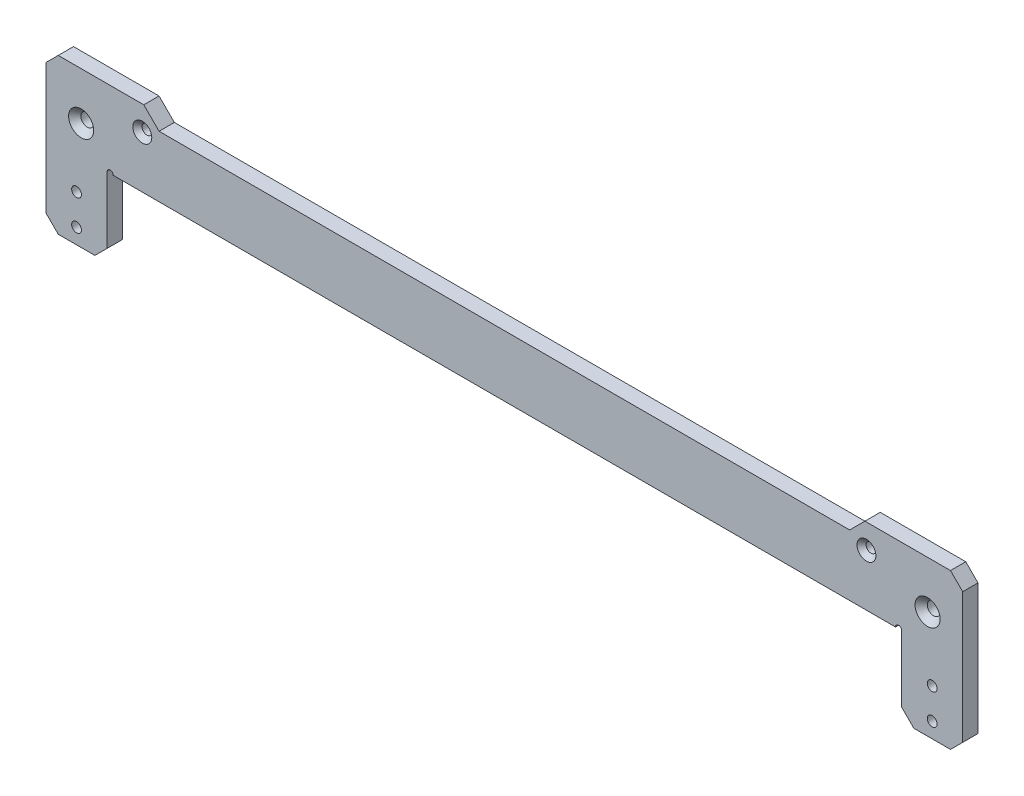
ISO-10303-21;
HEADER;
FILE_DESCRIPTION(('STEP AP214'),'2;1');
FILE_NAME('part.step','',(''),(''),'','','');
FILE_SCHEMA(('AUTOMOTIVE_DESIGN { 1 0 10303 214 1 1 1 1 }'));
ENDSEC;
DATA;
#1=APPLICATION_CONTEXT('core data for automotive mechanical design processes');
#2=APPLICATION_PROTOCOL_DEFINITION('international standard','automotive_design',2000,#1);
#3=PRODUCT_CONTEXT('',#1,'mechanical');
#4=PRODUCT('Part','Part','',(#3));
#5=PRODUCT_RELATED_PRODUCT_CATEGORY('part','',(#4));
#6=PRODUCT_DEFINITION_FORMATION('','',#4);
#7=PRODUCT_DEFINITION_CONTEXT('part definition',#1,'design');
#8=PRODUCT_DEFINITION('design','',#6,#7);
#9=PRODUCT_DEFINITION_SHAPE('','',#8);
#10=(LENGTH_UNIT() NAMED_UNIT(*) SI_UNIT(.MILLI.,.METRE.));
#11=(NAMED_UNIT(*) PLANE_ANGLE_UNIT() SI_UNIT($,.RADIAN.));
#12=(NAMED_UNIT(*) SI_UNIT($,.STERADIAN.) SOLID_ANGLE_UNIT());
#13=UNCERTAINTY_MEASURE_WITH_UNIT(LENGTH_MEASURE(1.E-05),#10,'distance_accuracy_value','');
#14=(GEOMETRIC_REPRESENTATION_CONTEXT(3) GLOBAL_UNCERTAINTY_ASSIGNED_CONTEXT((#13)) GLOBAL_UNIT_ASSIGNED_CONTEXT((#10,
#11,#12)) REPRESENTATION_CONTEXT('',''));
#15=CARTESIAN_POINT('',(0.,0.,0.));
#16=DIRECTION('',(0.,0.,1.));
#17=DIRECTION('',(1.,0.,0.));
#18=AXIS2_PLACEMENT_3D('',#15,#16,#17);
#19=CARTESIAN_POINT('',(150.,40.7,2.5));
#20=DIRECTION('',(0.,-1.,0.));
#21=DIRECTION('',(1.,0.,0.));
#22=AXIS2_PLACEMENT_3D('',#19,#20,#21);
#23=PLANE('',#22);
#24=DIRECTION('',(-1.,0.,0.));
#25=VECTOR('',#24,1.);
#26=CARTESIAN_POINT('',(150.,40.7,2.5));
#27=LINE('',#26,#25);
#28=CARTESIAN_POINT('',(146.,40.7,2.5));
#29=VERTEX_POINT('',#28);
#30=CARTESIAN_POINT('',(118.,40.7,2.5));
#31=VERTEX_POINT('',#30);
#32=EDGE_CURVE('E399',#29,#31,#27,.T.);
#33=ORIENTED_EDGE('',*,*,#32,.F.);
#34=DIRECTION('',(0.,0.,-1.));
#35=VECTOR('',#34,1.);
#36=CARTESIAN_POINT('',(146.,40.7,2.5));
#37=LINE('',#36,#35);
#38=CARTESIAN_POINT('',(146.,40.7,-2.5));
#39=VERTEX_POINT('',#38);
#40=EDGE_CURVE('E278',#29,#39,#37,.T.);
#41=ORIENTED_EDGE('',*,*,#40,.T.);
#42=DIRECTION('',(-1.,0.,0.));
#43=VECTOR('',#42,1.);
#44=CARTESIAN_POINT('',(150.,40.7,-2.5));
#45=LINE('',#44,#43);
#46=CARTESIAN_POINT('',(118.,40.7,-2.5));
#47=VERTEX_POINT('',#46);
#48=EDGE_CURVE('E218',#39,#47,#45,.T.);
#49=ORIENTED_EDGE('',*,*,#48,.T.);
#50=DIRECTION('',(0.,0.,1.));
#51=VECTOR('',#50,1.);
#52=CARTESIAN_POINT('',(118.,40.7,-2.5));
#53=LINE('',#52,#51);
#54=EDGE_CURVE('E351',#47,#31,#53,.T.);
#55=ORIENTED_EDGE('',*,*,#54,.T.);
#56=EDGE_LOOP('',(#33,#41,#49,#55));
#57=FACE_BOUND('',#56,.T.);
#58=ADVANCED_FACE('F37',(#57),#23,.F.);
#59=CARTESIAN_POINT('',(0.,0.,2.5));
#60=DIRECTION('',(0.,0.,1.));
#61=DIRECTION('',(1.,0.,0.));
#62=AXIS2_PLACEMENT_3D('',#59,#60,#61);
#63=PLANE('',#62);
#64=CARTESIAN_POINT('',(138.5,25.2,2.5));
#65=DIRECTION('',(0.,0.,1.));
#66=DIRECTION('',(1.,0.,0.));
#67=AXIS2_PLACEMENT_3D('',#64,#65,#66);
#68=CIRCLE('',#67,4.10000000000002);
#69=CARTESIAN_POINT('',(142.6,25.2,2.5));
#70=VERTEX_POINT('',#69);
#71=EDGE_CURVE('E46',#70,#70,#68,.F.);
#72=ORIENTED_EDGE('',*,*,#71,.T.);
#73=EDGE_LOOP('',(#72));
#74=FACE_BOUND('',#73,.T.);
#75=CARTESIAN_POINT('',(-138.5,25.2,2.5));
#76=DIRECTION('',(0.,0.,1.));
#77=DIRECTION('',(1.,0.,0.));
#78=AXIS2_PLACEMENT_3D('',#75,#76,#77);
#79=CIRCLE('',#78,4.10000000000002);
#80=CARTESIAN_POINT('',(-134.4,25.2,2.5));
#81=VERTEX_POINT('',#80);
#82=EDGE_CURVE('E297',#81,#81,#79,.F.);
#83=ORIENTED_EDGE('',*,*,#82,.T.);
#84=EDGE_LOOP('',(#83));
#85=FACE_BOUND('',#84,.T.);
#86=CARTESIAN_POINT('',(118.485281374238,32.7,2.5));
#87=DIRECTION('',(0.,0.,1.));
#88=DIRECTION('',(1.,0.,0.));
#89=AXIS2_PLACEMENT_3D('',#86,#87,#88);
#90=CIRCLE('',#89,3.09999999999996);
#91=CARTESIAN_POINT('',(121.585281374238,32.7,2.5));
#92=VERTEX_POINT('',#91);
#93=EDGE_CURVE('E288',#92,#92,#90,.F.);
#94=ORIENTED_EDGE('',*,*,#93,.T.);
#95=EDGE_LOOP('',(#94));
#96=FACE_BOUND('',#95,.T.);
#97=CARTESIAN_POINT('',(-118.485281374238,32.7,2.5));
#98=DIRECTION('',(0.,0.,1.));
#99=DIRECTION('',(1.,0.,0.));
#100=AXIS2_PLACEMENT_3D('',#97,#98,#99);
#101=CIRCLE('',#100,3.09999999999996);
#102=CARTESIAN_POINT('',(-115.385281374238,32.7,2.5));
#103=VERTEX_POINT('',#102);
#104=EDGE_CURVE('E285',#103,#103,#101,.F.);
#105=ORIENTED_EDGE('',*,*,#104,.T.);
#106=EDGE_LOOP('',(#105));
#107=FACE_BOUND('',#106,.T.);
#108=CARTESIAN_POINT('',(-129.,15.7,2.5));
#109=DIRECTION('',(0.,0.,-1.));
#110=DIRECTION('',(-1.,0.,0.));
#111=AXIS2_PLACEMENT_3D('',#108,#109,#110);
#112=CIRCLE('',#111,0.999999999999998);
#113=CARTESIAN_POINT('',(-130.,15.7,2.5));
#114=VERTEX_POINT('',#113);
#115=CARTESIAN_POINT('',(-128.,15.7,2.5));
#116=VERTEX_POINT('',#115);
#117=EDGE_CURVE('E188',#114,#116,#112,.T.);
#118=ORIENTED_EDGE('',*,*,#117,.T.);
#119=DIRECTION('',(1.,0.,0.));
#120=VECTOR('',#119,1.);
#121=CARTESIAN_POINT('',(-130.,15.7,2.5));
#122=LINE('',#121,#120);
#123=CARTESIAN_POINT('',(128.,15.7,2.5));
#124=VERTEX_POINT('',#123);
#125=EDGE_CURVE('E388',#116,#124,#122,.T.);
#126=ORIENTED_EDGE('',*,*,#125,.T.);
#127=CARTESIAN_POINT('',(129.,15.7,2.5));
#128=DIRECTION('',(0.,0.,-1.));
#129=DIRECTION('',(-1.,0.,0.));
#130=AXIS2_PLACEMENT_3D('',#127,#128,#129);
#131=CIRCLE('',#130,0.999999999999998);
#132=CARTESIAN_POINT('',(130.,15.7,2.5));
#133=VERTEX_POINT('',#132);
#134=EDGE_CURVE('E182',#124,#133,#131,.T.);
#135=ORIENTED_EDGE('',*,*,#134,.T.);
#136=DIRECTION('',(0.,-1.,0.));
#137=VECTOR('',#136,1.);
#138=CARTESIAN_POINT('',(130.,15.7,2.5));
#139=LINE('',#138,#137);
#140=CARTESIAN_POINT('',(130.,-5.99999999999996,2.5));
#141=VERTEX_POINT('',#140);
#142=EDGE_CURVE('E390',#133,#141,#139,.T.);
#143=ORIENTED_EDGE('',*,*,#142,.T.);
#144=DIRECTION('',(-0.707106781186543,0.707106781186552,0.));
#145=VECTOR('',#144,1.);
#146=CARTESIAN_POINT('',(62.0000000000009,62.,2.5));
#147=LINE('',#146,#145);
#148=CARTESIAN_POINT('',(134.,-10.,2.5));
#149=VERTEX_POINT('',#148);
#150=EDGE_CURVE('E251',#141,#149,#147,.F.);
#151=ORIENTED_EDGE('',*,*,#150,.T.);
#152=DIRECTION('',(1.,0.,0.));
#153=VECTOR('',#152,1.);
#154=CARTESIAN_POINT('',(130.,-10.,2.5));
#155=LINE('',#154,#153);
#156=CARTESIAN_POINT('',(146.,-10.,2.5));
#157=VERTEX_POINT('',#156);
#158=EDGE_CURVE('E393',#149,#157,#155,.T.);
#159=ORIENTED_EDGE('',*,*,#158,.T.);
#160=DIRECTION('',(-0.70710678118655,-0.707106781186545,0.));
#161=VECTOR('',#160,1.);
#162=CARTESIAN_POINT('',(77.9999999999994,-77.9999999999999,2.5));
#163=LINE('',#162,#161);
#164=CARTESIAN_POINT('',(150.,-6.00000000000002,2.5));
#165=VERTEX_POINT('',#164);
#166=EDGE_CURVE('E249',#157,#165,#163,.F.);
#167=ORIENTED_EDGE('',*,*,#166,.T.);
#168=DIRECTION('',(0.,1.,0.));
#169=VECTOR('',#168,1.);
#170=CARTESIAN_POINT('',(150.,-10.,2.5));
#171=LINE('',#170,#169);
#172=CARTESIAN_POINT('',(150.,36.6999999999999,2.5));
#173=VERTEX_POINT('',#172);
#174=EDGE_CURVE('E396',#165,#173,#171,.T.);
#175=ORIENTED_EDGE('',*,*,#174,.T.);
#176=DIRECTION('',(0.707106781186545,-0.70710678118655,0.));
#177=VECTOR('',#176,1.);
#178=CARTESIAN_POINT('',(93.3500000000004,93.3499999999998,2.5));
#179=LINE('',#178,#177);
#180=EDGE_CURVE('E53',#173,#29,#179,.F.);
#181=ORIENTED_EDGE('',*,*,#180,.T.);
#182=ORIENTED_EDGE('',*,*,#32,.T.);
#183=DIRECTION('',(0.707106781186547,0.707106781186548,0.));
#184=VECTOR('',#183,1.);
#185=CARTESIAN_POINT('',(118.,40.7,2.5));
#186=LINE('',#185,#184);
#187=CARTESIAN_POINT('',(113.,35.6999999999999,2.5));
#188=VERTEX_POINT('',#187);
#189=EDGE_CURVE('E337',#188,#31,#186,.T.);
#190=ORIENTED_EDGE('',*,*,#189,.F.);
#191=DIRECTION('',(1.,0.,0.));
#192=VECTOR('',#191,1.);
#193=CARTESIAN_POINT('',(113.,35.6999999999999,2.5));
#194=LINE('',#193,#192);
#195=CARTESIAN_POINT('',(-113.,35.6999999999999,2.5));
#196=VERTEX_POINT('',#195);
#197=EDGE_CURVE('E346',#196,#188,#194,.T.);
#198=ORIENTED_EDGE('',*,*,#197,.F.);
#199=DIRECTION('',(0.707106781186546,-0.707106781186549,0.));
#200=VECTOR('',#199,1.);
#201=CARTESIAN_POINT('',(-113.,35.6999999999999,2.5));
#202=LINE('',#201,#200);
#203=CARTESIAN_POINT('',(-118.,40.7,2.5));
#204=VERTEX_POINT('',#203);
#205=EDGE_CURVE('E187',#204,#196,#202,.T.);
#206=ORIENTED_EDGE('',*,*,#205,.F.);
#207=CARTESIAN_POINT('',(-146.,40.6999999999999,2.5));
#208=VERTEX_POINT('',#207);
#209=EDGE_CURVE('E398',#204,#208,#27,.T.);
#210=ORIENTED_EDGE('',*,*,#209,.T.);
#211=DIRECTION('',(0.70710678118655,0.707106781186545,0.));
#212=VECTOR('',#211,1.);
#213=CARTESIAN_POINT('',(-93.3499999999995,93.3500000000002,2.5));
#214=LINE('',#213,#212);
#215=CARTESIAN_POINT('',(-150.,36.7,2.5));
#216=VERTEX_POINT('',#215);
#217=EDGE_CURVE('E257',#208,#216,#214,.F.);
#218=ORIENTED_EDGE('',*,*,#217,.T.);
#219=DIRECTION('',(0.,-1.,0.));
#220=VECTOR('',#219,1.);
#221=CARTESIAN_POINT('',(-150.,40.6999999999999,2.5));
#222=LINE('',#221,#220);
#223=CARTESIAN_POINT('',(-150.,-5.99999999999994,2.5));
#224=VERTEX_POINT('',#223);
#225=EDGE_CURVE('E227',#216,#224,#222,.T.);
#226=ORIENTED_EDGE('',*,*,#225,.T.);
#227=DIRECTION('',(-0.707106781186545,0.70710678118655,0.));
#228=VECTOR('',#227,1.);
#229=CARTESIAN_POINT('',(-78.0000000000006,-78.,2.5));
#230=LINE('',#229,#228);
#231=CARTESIAN_POINT('',(-146.,-10.,2.5));
#232=VERTEX_POINT('',#231);
#233=EDGE_CURVE('E255',#224,#232,#230,.F.);
#234=ORIENTED_EDGE('',*,*,#233,.T.);
#235=DIRECTION('',(1.,0.,0.));
#236=VECTOR('',#235,1.);
#237=CARTESIAN_POINT('',(-150.,-10.,2.5));
#238=LINE('',#237,#236);
#239=CARTESIAN_POINT('',(-134.,-10.,2.5));
#240=VERTEX_POINT('',#239);
#241=EDGE_CURVE('E223',#232,#240,#238,.T.);
#242=ORIENTED_EDGE('',*,*,#241,.T.);
#243=DIRECTION('',(-0.70710678118655,-0.707106781186545,0.));
#244=VECTOR('',#243,1.);
#245=CARTESIAN_POINT('',(-61.9999999999996,62.0000000000001,2.5));
#246=LINE('',#245,#244);
#247=CARTESIAN_POINT('',(-130.,-6.00000000000002,2.5));
#248=VERTEX_POINT('',#247);
#249=EDGE_CURVE('E253',#240,#248,#246,.F.);
#250=ORIENTED_EDGE('',*,*,#249,.T.);
#251=DIRECTION('',(0.,1.,0.));
#252=VECTOR('',#251,1.);
#253=CARTESIAN_POINT('',(-130.,-10.,2.5));
#254=LINE('',#253,#252);
#255=EDGE_CURVE('E385',#248,#114,#254,.T.);
#256=ORIENTED_EDGE('',*,*,#255,.T.);
#257=EDGE_LOOP('',(#118,#126,#135,#143,#151,#159,#167,#175,#181,#182,#190,#198,#206,#210,#218,
#226,#234,#242,#250,#256));
#258=FACE_BOUND('',#257,.T.);
#259=CARTESIAN_POINT('',(140.,5.00000000000001,2.5));
#260=DIRECTION('',(0.,0.,1.));
#261=DIRECTION('',(1.,0.,0.));
#262=AXIS2_PLACEMENT_3D('',#259,#260,#261);
#263=CIRCLE('',#262,1.59999999999999);
#264=CARTESIAN_POINT('',(141.6,5.00000000000001,2.5));
#265=VERTEX_POINT('',#264);
#266=EDGE_CURVE('E366',#265,#265,#263,.T.);
#267=ORIENTED_EDGE('',*,*,#266,.F.);
#268=EDGE_LOOP('',(#267));
#269=FACE_BOUND('',#268,.T.);
#270=CARTESIAN_POINT('',(-140.,4.99999999999998,2.5));
#271=DIRECTION('',(0.,0.,1.));
#272=DIRECTION('',(1.,0.,0.));
#273=AXIS2_PLACEMENT_3D('',#270,#271,#272);
#274=CIRCLE('',#273,1.59999999999999);
#275=CARTESIAN_POINT('',(-138.4,4.99999999999998,2.5));
#276=VERTEX_POINT('',#275);
#277=EDGE_CURVE('E378',#276,#276,#274,.T.);
#278=ORIENTED_EDGE('',*,*,#277,.F.);
#279=EDGE_LOOP('',(#278));
#280=FACE_BOUND('',#279,.T.);
#281=CARTESIAN_POINT('',(-140.,-5.00000000000002,2.5));
#282=DIRECTION('',(0.,0.,1.));
#283=DIRECTION('',(1.,0.,0.));
#284=AXIS2_PLACEMENT_3D('',#281,#282,#283);
#285=CIRCLE('',#284,1.59999999999999);
#286=CARTESIAN_POINT('',(-138.4,-5.00000000000002,2.5));
#287=VERTEX_POINT('',#286);
#288=EDGE_CURVE('E372',#287,#287,#285,.T.);
#289=ORIENTED_EDGE('',*,*,#288,.F.);
#290=EDGE_LOOP('',(#289));
#291=FACE_BOUND('',#290,.T.);
#292=CARTESIAN_POINT('',(140.,-4.99999999999999,2.5));
#293=DIRECTION('',(0.,0.,1.));
#294=DIRECTION('',(1.,0.,0.));
#295=AXIS2_PLACEMENT_3D('',#292,#293,#294);
#296=CIRCLE('',#295,1.59999999999999);
#297=CARTESIAN_POINT('',(141.6,-4.99999999999999,2.5));
#298=VERTEX_POINT('',#297);
#299=EDGE_CURVE('E360',#298,#298,#296,.T.);
#300=ORIENTED_EDGE('',*,*,#299,.F.);
#301=EDGE_LOOP('',(#300));
#302=FACE_BOUND('',#301,.T.);
#303=ADVANCED_FACE('F302',(#74,#85,#96,#107,#258,#269,#280,#291,#302),#63,.T.);
#304=CARTESIAN_POINT('',(0.,0.,-2.5));
#305=DIRECTION('',(0.,0.,1.));
#306=DIRECTION('',(1.,0.,0.));
#307=AXIS2_PLACEMENT_3D('',#304,#305,#306);
#308=PLANE('',#307);
#309=CARTESIAN_POINT('',(-138.5,25.2,-2.5));
#310=DIRECTION('',(0.,0.,1.));
#311=DIRECTION('',(1.,0.,0.));
#312=AXIS2_PLACEMENT_3D('',#309,#310,#311);
#313=CIRCLE('',#312,2.09999999999999);
#314=CARTESIAN_POINT('',(-136.4,25.2,-2.5));
#315=VERTEX_POINT('',#314);
#316=EDGE_CURVE('E199',#315,#315,#313,.T.);
#317=ORIENTED_EDGE('',*,*,#316,.T.);
#318=EDGE_LOOP('',(#317));
#319=FACE_BOUND('',#318,.T.);
#320=CARTESIAN_POINT('',(118.485281374238,32.7,-2.5));
#321=DIRECTION('',(0.,0.,1.));
#322=DIRECTION('',(1.,0.,0.));
#323=AXIS2_PLACEMENT_3D('',#320,#321,#322);
#324=CIRCLE('',#323,1.60000000000001);
#325=CARTESIAN_POINT('',(120.085281374238,32.7,-2.5));
#326=VERTEX_POINT('',#325);
#327=EDGE_CURVE('E324',#326,#326,#324,.T.);
#328=ORIENTED_EDGE('',*,*,#327,.T.);
#329=EDGE_LOOP('',(#328));
#330=FACE_BOUND('',#329,.T.);
#331=CARTESIAN_POINT('',(-118.485281374238,32.7,-2.5));
#332=DIRECTION('',(0.,0.,1.));
#333=DIRECTION('',(1.,0.,0.));
#334=AXIS2_PLACEMENT_3D('',#331,#332,#333);
#335=CIRCLE('',#334,1.60000000000001);
#336=CARTESIAN_POINT('',(-116.885281374238,32.7,-2.5));
#337=VERTEX_POINT('',#336);
#338=EDGE_CURVE('E321',#337,#337,#335,.T.);
#339=ORIENTED_EDGE('',*,*,#338,.T.);
#340=EDGE_LOOP('',(#339));
#341=FACE_BOUND('',#340,.T.);
#342=CARTESIAN_POINT('',(138.5,25.2,-2.5));
#343=DIRECTION('',(0.,0.,1.));
#344=DIRECTION('',(-1.,0.,0.));
#345=AXIS2_PLACEMENT_3D('',#342,#343,#344);
#346=CIRCLE('',#345,2.09999999999999);
#347=CARTESIAN_POINT('',(136.4,25.2,-2.5));
#348=VERTEX_POINT('',#347);
#349=EDGE_CURVE('E319',#348,#348,#346,.T.);
#350=ORIENTED_EDGE('',*,*,#349,.T.);
#351=EDGE_LOOP('',(#350));
#352=FACE_BOUND('',#351,.T.);
#353=DIRECTION('',(1.,0.,0.));
#354=VECTOR('',#353,1.);
#355=CARTESIAN_POINT('',(-130.,15.7,-2.5));
#356=LINE('',#355,#354);
#357=CARTESIAN_POINT('',(-128.,15.7,-2.5));
#358=VERTEX_POINT('',#357);
#359=CARTESIAN_POINT('',(128.,15.7,-2.5));
#360=VERTEX_POINT('',#359);
#361=EDGE_CURVE('E196',#358,#360,#356,.T.);
#362=ORIENTED_EDGE('',*,*,#361,.F.);
#363=CARTESIAN_POINT('',(-129.,15.7,-2.5));
#364=DIRECTION('',(0.,0.,-1.));
#365=DIRECTION('',(-1.,0.,0.));
#366=AXIS2_PLACEMENT_3D('',#363,#364,#365);
#367=CIRCLE('',#366,0.999999999999998);
#368=CARTESIAN_POINT('',(-130.,15.7,-2.5));
#369=VERTEX_POINT('',#368);
#370=EDGE_CURVE('E330',#369,#358,#367,.T.);
#371=ORIENTED_EDGE('',*,*,#370,.F.);
#372=DIRECTION('',(0.,1.,0.));
#373=VECTOR('',#372,1.);
#374=CARTESIAN_POINT('',(-130.,-10.,-2.5));
#375=LINE('',#374,#373);
#376=CARTESIAN_POINT('',(-130.,-6.00000000000002,-2.5));
#377=VERTEX_POINT('',#376);
#378=EDGE_CURVE('E204',#377,#369,#375,.T.);
#379=ORIENTED_EDGE('',*,*,#378,.F.);
#380=DIRECTION('',(0.70710678118655,0.707106781186545,0.));
#381=VECTOR('',#380,1.);
#382=CARTESIAN_POINT('',(-130.,-6.00000000000002,-2.5));
#383=LINE('',#382,#381);
#384=CARTESIAN_POINT('',(-134.,-10.,-2.5));
#385=VERTEX_POINT('',#384);
#386=EDGE_CURVE('E240',#377,#385,#383,.F.);
#387=ORIENTED_EDGE('',*,*,#386,.T.);
#388=DIRECTION('',(1.,0.,0.));
#389=VECTOR('',#388,1.);
#390=CARTESIAN_POINT('',(-150.,-10.,-2.5));
#391=LINE('',#390,#389);
#392=CARTESIAN_POINT('',(-146.,-10.,-2.5));
#393=VERTEX_POINT('',#392);
#394=EDGE_CURVE('E209',#393,#385,#391,.T.);
#395=ORIENTED_EDGE('',*,*,#394,.F.);
#396=DIRECTION('',(0.707106781186545,-0.70710678118655,0.));
#397=VECTOR('',#396,1.);
#398=CARTESIAN_POINT('',(-146.,-10.,-2.5));
#399=LINE('',#398,#397);
#400=CARTESIAN_POINT('',(-150.,-5.99999999999994,-2.5));
#401=VERTEX_POINT('',#400);
#402=EDGE_CURVE('E242',#393,#401,#399,.F.);
#403=ORIENTED_EDGE('',*,*,#402,.T.);
#404=DIRECTION('',(0.,-1.,0.));
#405=VECTOR('',#404,1.);
#406=CARTESIAN_POINT('',(-150.,40.6999999999999,-2.5));
#407=LINE('',#406,#405);
#408=CARTESIAN_POINT('',(-150.,36.7,-2.5));
#409=VERTEX_POINT('',#408);
#410=EDGE_CURVE('E220',#409,#401,#407,.T.);
#411=ORIENTED_EDGE('',*,*,#410,.F.);
#412=DIRECTION('',(-0.70710678118655,-0.707106781186545,0.));
#413=VECTOR('',#412,1.);
#414=CARTESIAN_POINT('',(-150.,36.7,-2.5));
#415=LINE('',#414,#413);
#416=CARTESIAN_POINT('',(-146.,40.6999999999999,-2.5));
#417=VERTEX_POINT('',#416);
#418=EDGE_CURVE('E244',#409,#417,#415,.F.);
#419=ORIENTED_EDGE('',*,*,#418,.T.);
#420=CARTESIAN_POINT('',(-118.,40.6999999999999,-2.5));
#421=VERTEX_POINT('',#420);
#422=EDGE_CURVE('E217',#421,#417,#45,.T.);
#423=ORIENTED_EDGE('',*,*,#422,.F.);
#424=DIRECTION('',(0.707106781186546,-0.707106781186549,0.));
#425=VECTOR('',#424,1.);
#426=CARTESIAN_POINT('',(-113.,35.6999999999999,-2.5));
#427=LINE('',#426,#425);
#428=CARTESIAN_POINT('',(-113.,35.6999999999999,-2.5));
#429=VERTEX_POINT('',#428);
#430=EDGE_CURVE('E333',#421,#429,#427,.T.);
#431=ORIENTED_EDGE('',*,*,#430,.T.);
#432=DIRECTION('',(1.,0.,0.));
#433=VECTOR('',#432,1.);
#434=CARTESIAN_POINT('',(113.,35.6999999999999,-2.5));
#435=LINE('',#434,#433);
#436=CARTESIAN_POINT('',(113.,35.6999999999999,-2.5));
#437=VERTEX_POINT('',#436);
#438=EDGE_CURVE('E336',#429,#437,#435,.T.);
#439=ORIENTED_EDGE('',*,*,#438,.T.);
#440=DIRECTION('',(0.707106781186547,0.707106781186548,0.));
#441=VECTOR('',#440,1.);
#442=CARTESIAN_POINT('',(118.,40.7,-2.5));
#443=LINE('',#442,#441);
#444=EDGE_CURVE('E340',#437,#47,#443,.T.);
#445=ORIENTED_EDGE('',*,*,#444,.T.);
#446=ORIENTED_EDGE('',*,*,#48,.F.);
#447=DIRECTION('',(-0.707106781186545,0.70710678118655,0.));
#448=VECTOR('',#447,1.);
#449=CARTESIAN_POINT('',(146.,40.7,-2.5));
#450=LINE('',#449,#448);
#451=CARTESIAN_POINT('',(150.,36.6999999999999,-2.5));
#452=VERTEX_POINT('',#451);
#453=EDGE_CURVE('E234',#39,#452,#450,.F.);
#454=ORIENTED_EDGE('',*,*,#453,.T.);
#455=DIRECTION('',(0.,1.,0.));
#456=VECTOR('',#455,1.);
#457=CARTESIAN_POINT('',(150.,-10.,-2.5));
#458=LINE('',#457,#456);
#459=CARTESIAN_POINT('',(150.,-6.00000000000002,-2.5));
#460=VERTEX_POINT('',#459);
#461=EDGE_CURVE('E215',#460,#452,#458,.T.);
#462=ORIENTED_EDGE('',*,*,#461,.F.);
#463=DIRECTION('',(0.70710678118655,0.707106781186545,0.));
#464=VECTOR('',#463,1.);
#465=CARTESIAN_POINT('',(150.,-6.00000000000002,-2.5));
#466=LINE('',#465,#464);
#467=CARTESIAN_POINT('',(146.,-10.,-2.5));
#468=VERTEX_POINT('',#467);
#469=EDGE_CURVE('E236',#460,#468,#466,.F.);
#470=ORIENTED_EDGE('',*,*,#469,.T.);
#471=DIRECTION('',(1.,0.,0.));
#472=VECTOR('',#471,1.);
#473=CARTESIAN_POINT('',(130.,-10.,-2.5));
#474=LINE('',#473,#472);
#475=CARTESIAN_POINT('',(134.,-10.,-2.5));
#476=VERTEX_POINT('',#475);
#477=EDGE_CURVE('E206',#476,#468,#474,.T.);
#478=ORIENTED_EDGE('',*,*,#477,.F.);
#479=DIRECTION('',(0.707106781186543,-0.707106781186552,0.));
#480=VECTOR('',#479,1.);
#481=CARTESIAN_POINT('',(134.,-10.,-2.5));
#482=LINE('',#481,#480);
#483=CARTESIAN_POINT('',(130.,-5.99999999999996,-2.5));
#484=VERTEX_POINT('',#483);
#485=EDGE_CURVE('E238',#476,#484,#482,.F.);
#486=ORIENTED_EDGE('',*,*,#485,.T.);
#487=DIRECTION('',(0.,-1.,0.));
#488=VECTOR('',#487,1.);
#489=CARTESIAN_POINT('',(130.,15.7,-2.5));
#490=LINE('',#489,#488);
#491=CARTESIAN_POINT('',(130.,15.7,-2.5));
#492=VERTEX_POINT('',#491);
#493=EDGE_CURVE('E198',#492,#484,#490,.T.);
#494=ORIENTED_EDGE('',*,*,#493,.F.);
#495=CARTESIAN_POINT('',(129.,15.7,-2.5));
#496=DIRECTION('',(0.,0.,-1.));
#497=DIRECTION('',(-1.,0.,0.));
#498=AXIS2_PLACEMENT_3D('',#495,#496,#497);
#499=CIRCLE('',#498,0.999999999999998);
#500=EDGE_CURVE('E179',#360,#492,#499,.T.);
#501=ORIENTED_EDGE('',*,*,#500,.F.);
#502=EDGE_LOOP('',(#362,#371,#379,#387,#395,#403,#411,#419,#423,#431,#439,#445,#446,#454,#462,
#470,#478,#486,#494,#501));
#503=FACE_BOUND('',#502,.T.);
#504=CARTESIAN_POINT('',(-140.,4.99999999999998,-2.5));
#505=DIRECTION('',(0.,0.,1.));
#506=DIRECTION('',(1.,0.,0.));
#507=AXIS2_PLACEMENT_3D('',#504,#505,#506);
#508=CIRCLE('',#507,1.59999999999999);
#509=CARTESIAN_POINT('',(-138.4,4.99999999999998,-2.5));
#510=VERTEX_POINT('',#509);
#511=EDGE_CURVE('E375',#510,#510,#508,.T.);
#512=ORIENTED_EDGE('',*,*,#511,.T.);
#513=EDGE_LOOP('',(#512));
#514=FACE_BOUND('',#513,.T.);
#515=CARTESIAN_POINT('',(-140.,-5.00000000000002,-2.5));
#516=DIRECTION('',(0.,0.,1.));
#517=DIRECTION('',(1.,0.,0.));
#518=AXIS2_PLACEMENT_3D('',#515,#516,#517);
#519=CIRCLE('',#518,1.59999999999999);
#520=CARTESIAN_POINT('',(-138.4,-5.00000000000002,-2.5));
#521=VERTEX_POINT('',#520);
#522=EDGE_CURVE('E369',#521,#521,#519,.T.);
#523=ORIENTED_EDGE('',*,*,#522,.T.);
#524=EDGE_LOOP('',(#523));
#525=FACE_BOUND('',#524,.T.);
#526=CARTESIAN_POINT('',(140.,5.00000000000001,-2.5));
#527=DIRECTION('',(0.,0.,1.));
#528=DIRECTION('',(1.,0.,0.));
#529=AXIS2_PLACEMENT_3D('',#526,#527,#528);
#530=CIRCLE('',#529,1.59999999999999);
#531=CARTESIAN_POINT('',(141.6,5.00000000000001,-2.5));
#532=VERTEX_POINT('',#531);
#533=EDGE_CURVE('E363',#532,#532,#530,.T.);
#534=ORIENTED_EDGE('',*,*,#533,.T.);
#535=EDGE_LOOP('',(#534));
#536=FACE_BOUND('',#535,.T.);
#537=CARTESIAN_POINT('',(140.,-4.99999999999999,-2.5));
#538=DIRECTION('',(0.,0.,1.));
#539=DIRECTION('',(1.,0.,0.));
#540=AXIS2_PLACEMENT_3D('',#537,#538,#539);
#541=CIRCLE('',#540,1.59999999999999);
#542=CARTESIAN_POINT('',(141.6,-4.99999999999999,-2.5));
#543=VERTEX_POINT('',#542);
#544=EDGE_CURVE('E354',#543,#543,#541,.T.);
#545=ORIENTED_EDGE('',*,*,#544,.T.);
#546=EDGE_LOOP('',(#545));
#547=FACE_BOUND('',#546,.T.);
#548=ADVANCED_FACE('F193',(#319,#330,#341,#352,#503,#514,#525,#536,#547),#308,.F.);
#549=CARTESIAN_POINT('',(-150.,-10.,2.5));
#550=DIRECTION('',(0.,1.,0.));
#551=DIRECTION('',(0.,0.,1.));
#552=AXIS2_PLACEMENT_3D('',#549,#550,#551);
#553=PLANE('',#552);
#554=ORIENTED_EDGE('',*,*,#241,.F.);
#555=DIRECTION('',(0.,0.,-1.));
#556=VECTOR('',#555,1.);
#557=CARTESIAN_POINT('',(-146.,-10.,2.5));
#558=LINE('',#557,#556);
#559=EDGE_CURVE('E261',#232,#393,#558,.T.);
#560=ORIENTED_EDGE('',*,*,#559,.T.);
#561=ORIENTED_EDGE('',*,*,#394,.T.);
#562=DIRECTION('',(0.,0.,1.));
#563=VECTOR('',#562,1.);
#564=CARTESIAN_POINT('',(-134.,-10.,2.5));
#565=LINE('',#564,#563);
#566=EDGE_CURVE('E259',#385,#240,#565,.T.);
#567=ORIENTED_EDGE('',*,*,#566,.T.);
#568=EDGE_LOOP('',(#554,#560,#561,#567));
#569=FACE_BOUND('',#568,.T.);
#570=ADVANCED_FACE('F407',(#569),#553,.F.);
#571=CARTESIAN_POINT('',(-130.,-10.,2.5));
#572=DIRECTION('',(-1.,0.,0.));
#573=DIRECTION('',(0.,0.,1.));
#574=AXIS2_PLACEMENT_3D('',#571,#572,#573);
#575=PLANE('',#574);
#576=ORIENTED_EDGE('',*,*,#255,.F.);
#577=DIRECTION('',(0.,0.,-1.));
#578=VECTOR('',#577,1.);
#579=CARTESIAN_POINT('',(-130.,-6.00000000000002,2.5));
#580=LINE('',#579,#578);
#581=EDGE_CURVE('E264',#248,#377,#580,.T.);
#582=ORIENTED_EDGE('',*,*,#581,.T.);
#583=ORIENTED_EDGE('',*,*,#378,.T.);
#584=DIRECTION('',(0.,0.,-1.));
#585=VECTOR('',#584,1.);
#586=CARTESIAN_POINT('',(-130.,15.7,2.5));
#587=LINE('',#586,#585);
#588=EDGE_CURVE('E226',#114,#369,#587,.T.);
#589=ORIENTED_EDGE('',*,*,#588,.F.);
#590=EDGE_LOOP('',(#576,#582,#583,#589));
#591=FACE_BOUND('',#590,.T.);
#592=ADVANCED_FACE('F417',(#591),#575,.F.);
#593=CARTESIAN_POINT('',(-130.,15.7,2.5));
#594=DIRECTION('',(0.,1.,0.));
#595=DIRECTION('',(0.,0.,1.));
#596=AXIS2_PLACEMENT_3D('',#593,#594,#595);
#597=PLANE('',#596);
#598=ORIENTED_EDGE('',*,*,#125,.F.);
#599=DIRECTION('',(0.,0.,-1.));
#600=VECTOR('',#599,1.);
#601=CARTESIAN_POINT('',(-128.,15.7,2.5));
#602=LINE('',#601,#600);
#603=EDGE_CURVE('E203',#116,#358,#602,.T.);
#604=ORIENTED_EDGE('',*,*,#603,.T.);
#605=ORIENTED_EDGE('',*,*,#361,.T.);
#606=DIRECTION('',(0.,0.,-1.));
#607=VECTOR('',#606,1.);
#608=CARTESIAN_POINT('',(128.,15.7,2.5));
#609=LINE('',#608,#607);
#610=EDGE_CURVE('E176',#360,#124,#609,.F.);
#611=ORIENTED_EDGE('',*,*,#610,.T.);
#612=EDGE_LOOP('',(#598,#604,#605,#611));
#613=FACE_BOUND('',#612,.T.);
#614=ADVANCED_FACE('F202',(#613),#597,.F.);
#615=CARTESIAN_POINT('',(130.,15.7,2.5));
#616=DIRECTION('',(1.,0.,0.));
#617=DIRECTION('',(0.,0.,-1.));
#618=AXIS2_PLACEMENT_3D('',#615,#616,#617);
#619=PLANE('',#618);
#620=ORIENTED_EDGE('',*,*,#493,.T.);
#621=DIRECTION('',(0.,0.,1.));
#622=VECTOR('',#621,1.);
#623=CARTESIAN_POINT('',(130.,-5.99999999999996,2.5));
#624=LINE('',#623,#622);
#625=EDGE_CURVE('E272',#484,#141,#624,.T.);
#626=ORIENTED_EDGE('',*,*,#625,.T.);
#627=ORIENTED_EDGE('',*,*,#142,.F.);
#628=DIRECTION('',(0.,0.,-1.));
#629=VECTOR('',#628,1.);
#630=CARTESIAN_POINT('',(130.,15.7,2.5));
#631=LINE('',#630,#629);
#632=EDGE_CURVE('E224',#133,#492,#631,.T.);
#633=ORIENTED_EDGE('',*,*,#632,.T.);
#634=EDGE_LOOP('',(#620,#626,#627,#633));
#635=FACE_BOUND('',#634,.T.);
#636=ADVANCED_FACE('F423',(#635),#619,.F.);
#637=CARTESIAN_POINT('',(130.,-10.,2.5));
#638=DIRECTION('',(0.,1.,0.));
#639=DIRECTION('',(0.,0.,1.));
#640=AXIS2_PLACEMENT_3D('',#637,#638,#639);
#641=PLANE('',#640);
#642=ORIENTED_EDGE('',*,*,#158,.F.);
#643=DIRECTION('',(0.,0.,-1.));
#644=VECTOR('',#643,1.);
#645=CARTESIAN_POINT('',(134.,-10.,2.5));
#646=LINE('',#645,#644);
#647=EDGE_CURVE('E269',#149,#476,#646,.T.);
#648=ORIENTED_EDGE('',*,*,#647,.T.);
#649=ORIENTED_EDGE('',*,*,#477,.T.);
#650=DIRECTION('',(0.,0.,1.));
#651=VECTOR('',#650,1.);
#652=CARTESIAN_POINT('',(146.,-10.,2.5));
#653=LINE('',#652,#651);
#654=EDGE_CURVE('E267',#468,#157,#653,.T.);
#655=ORIENTED_EDGE('',*,*,#654,.T.);
#656=EDGE_LOOP('',(#642,#648,#649,#655));
#657=FACE_BOUND('',#656,.T.);
#658=ADVANCED_FACE('F431',(#657),#641,.F.);
#659=CARTESIAN_POINT('',(150.,-10.,2.5));
#660=DIRECTION('',(-1.,0.,0.));
#661=DIRECTION('',(0.,0.,1.));
#662=AXIS2_PLACEMENT_3D('',#659,#660,#661);
#663=PLANE('',#662);
#664=ORIENTED_EDGE('',*,*,#174,.F.);
#665=DIRECTION('',(0.,0.,-1.));
#666=VECTOR('',#665,1.);
#667=CARTESIAN_POINT('',(150.,-6.00000000000002,2.5));
#668=LINE('',#667,#666);
#669=EDGE_CURVE('E275',#165,#460,#668,.T.);
#670=ORIENTED_EDGE('',*,*,#669,.T.);
#671=ORIENTED_EDGE('',*,*,#461,.T.);
#672=DIRECTION('',(0.,0.,1.));
#673=VECTOR('',#672,1.);
#674=CARTESIAN_POINT('',(150.,36.6999999999999,2.5));
#675=LINE('',#674,#673);
#676=EDGE_CURVE('E61',#452,#173,#675,.T.);
#677=ORIENTED_EDGE('',*,*,#676,.T.);
#678=EDGE_LOOP('',(#664,#670,#671,#677));
#679=FACE_BOUND('',#678,.T.);
#680=ADVANCED_FACE('F437',(#679),#663,.F.);
#681=ORIENTED_EDGE('',*,*,#422,.T.);
#682=DIRECTION('',(0.,0.,1.));
#683=VECTOR('',#682,1.);
#684=CARTESIAN_POINT('',(-146.,40.6999999999999,2.5));
#685=LINE('',#684,#683);
#686=EDGE_CURVE('E246',#417,#208,#685,.T.);
#687=ORIENTED_EDGE('',*,*,#686,.T.);
#688=ORIENTED_EDGE('',*,*,#209,.F.);
#689=DIRECTION('',(0.,0.,1.));
#690=VECTOR('',#689,1.);
#691=CARTESIAN_POINT('',(-118.,40.7,-2.5));
#692=LINE('',#691,#690);
#693=EDGE_CURVE('E343',#421,#204,#692,.T.);
#694=ORIENTED_EDGE('',*,*,#693,.F.);
#695=EDGE_LOOP('',(#681,#687,#688,#694));
#696=FACE_BOUND('',#695,.T.);
#697=ADVANCED_FACE('F461',(#696),#23,.F.);
#698=CARTESIAN_POINT('',(-150.,40.6999999999999,2.5));
#699=DIRECTION('',(1.,0.,0.));
#700=DIRECTION('',(0.,0.,-1.));
#701=AXIS2_PLACEMENT_3D('',#698,#699,#700);
#702=PLANE('',#701);
#703=ORIENTED_EDGE('',*,*,#225,.F.);
#704=DIRECTION('',(0.,0.,-1.));
#705=VECTOR('',#704,1.);
#706=CARTESIAN_POINT('',(-150.,36.7,2.5));
#707=LINE('',#706,#705);
#708=EDGE_CURVE('E231',#216,#409,#707,.T.);
#709=ORIENTED_EDGE('',*,*,#708,.T.);
#710=ORIENTED_EDGE('',*,*,#410,.T.);
#711=DIRECTION('',(0.,0.,1.));
#712=VECTOR('',#711,1.);
#713=CARTESIAN_POINT('',(-150.,-5.99999999999994,2.5));
#714=LINE('',#713,#712);
#715=EDGE_CURVE('E229',#401,#224,#714,.T.);
#716=ORIENTED_EDGE('',*,*,#715,.T.);
#717=EDGE_LOOP('',(#703,#709,#710,#716));
#718=FACE_BOUND('',#717,.T.);
#719=ADVANCED_FACE('F470',(#718),#702,.F.);
#720=CARTESIAN_POINT('',(-140.,4.99999999999998,2.5));
#721=DIRECTION('',(0.,0.,-1.));
#722=DIRECTION('',(-1.,0.,0.));
#723=AXIS2_PLACEMENT_3D('',#720,#721,#722);
#724=CYLINDRICAL_SURFACE('',#723,1.59999999999999);
#725=ORIENTED_EDGE('',*,*,#277,.T.);
#726=EDGE_LOOP('',(#725));
#727=FACE_BOUND('',#726,.T.);
#728=ORIENTED_EDGE('',*,*,#511,.F.);
#729=EDGE_LOOP('',(#728));
#730=FACE_BOUND('',#729,.T.);
#731=ADVANCED_FACE('F498',(#727,#730),#724,.F.);
#732=CARTESIAN_POINT('',(-140.,-5.00000000000002,2.5));
#733=DIRECTION('',(0.,0.,-1.));
#734=DIRECTION('',(-1.,0.,0.));
#735=AXIS2_PLACEMENT_3D('',#732,#733,#734);
#736=CYLINDRICAL_SURFACE('',#735,1.59999999999999);
#737=ORIENTED_EDGE('',*,*,#288,.T.);
#738=EDGE_LOOP('',(#737));
#739=FACE_BOUND('',#738,.T.);
#740=ORIENTED_EDGE('',*,*,#522,.F.);
#741=EDGE_LOOP('',(#740));
#742=FACE_BOUND('',#741,.T.);
#743=ADVANCED_FACE('F580',(#739,#742),#736,.F.);
#744=CARTESIAN_POINT('',(140.,5.00000000000001,2.5));
#745=DIRECTION('',(0.,0.,-1.));
#746=DIRECTION('',(-1.,0.,0.));
#747=AXIS2_PLACEMENT_3D('',#744,#745,#746);
#748=CYLINDRICAL_SURFACE('',#747,1.59999999999999);
#749=ORIENTED_EDGE('',*,*,#266,.T.);
#750=EDGE_LOOP('',(#749));
#751=FACE_BOUND('',#750,.T.);
#752=ORIENTED_EDGE('',*,*,#533,.F.);
#753=EDGE_LOOP('',(#752));
#754=FACE_BOUND('',#753,.T.);
#755=ADVANCED_FACE('F584',(#751,#754),#748,.F.);
#756=CARTESIAN_POINT('',(140.,-4.99999999999999,2.5));
#757=DIRECTION('',(0.,0.,-1.));
#758=DIRECTION('',(-1.,0.,0.));
#759=AXIS2_PLACEMENT_3D('',#756,#757,#758);
#760=CYLINDRICAL_SURFACE('',#759,1.59999999999999);
#761=ORIENTED_EDGE('',*,*,#299,.T.);
#762=EDGE_LOOP('',(#761));
#763=FACE_BOUND('',#762,.T.);
#764=ORIENTED_EDGE('',*,*,#544,.F.);
#765=EDGE_LOOP('',(#764));
#766=FACE_BOUND('',#765,.T.);
#767=ADVANCED_FACE('F587',(#763,#766),#760,.F.);
#768=CARTESIAN_POINT('',(118.,40.7,-2.5));
#769=DIRECTION('',(0.707106781186548,-0.707106781186547,0.));
#770=DIRECTION('',(0.707106781186547,0.707106781186548,0.));
#771=AXIS2_PLACEMENT_3D('',#768,#769,#770);
#772=PLANE('',#771);
#773=ORIENTED_EDGE('',*,*,#189,.T.);
#774=ORIENTED_EDGE('',*,*,#54,.F.);
#775=ORIENTED_EDGE('',*,*,#444,.F.);
#776=DIRECTION('',(0.,0.,1.));
#777=VECTOR('',#776,1.);
#778=CARTESIAN_POINT('',(113.,35.6999999999999,-2.5));
#779=LINE('',#778,#777);
#780=EDGE_CURVE('E355',#437,#188,#779,.T.);
#781=ORIENTED_EDGE('',*,*,#780,.T.);
#782=EDGE_LOOP('',(#773,#774,#775,#781));
#783=FACE_BOUND('',#782,.T.);
#784=ADVANCED_FACE('F448',(#783),#772,.F.);
#785=CARTESIAN_POINT('',(113.,35.6999999999999,-2.5));
#786=DIRECTION('',(0.,-1.,0.));
#787=DIRECTION('',(0.,0.,-1.));
#788=AXIS2_PLACEMENT_3D('',#785,#786,#787);
#789=PLANE('',#788);
#790=ORIENTED_EDGE('',*,*,#197,.T.);
#791=ORIENTED_EDGE('',*,*,#780,.F.);
#792=ORIENTED_EDGE('',*,*,#438,.F.);
#793=DIRECTION('',(0.,0.,1.));
#794=VECTOR('',#793,1.);
#795=CARTESIAN_POINT('',(-113.,35.6999999999999,-2.5));
#796=LINE('',#795,#794);
#797=EDGE_CURVE('E357',#429,#196,#796,.T.);
#798=ORIENTED_EDGE('',*,*,#797,.T.);
#799=EDGE_LOOP('',(#790,#791,#792,#798));
#800=FACE_BOUND('',#799,.T.);
#801=ADVANCED_FACE('F452',(#800),#789,.F.);
#802=CARTESIAN_POINT('',(-113.,35.6999999999999,-2.5));
#803=DIRECTION('',(-0.707106781186549,-0.707106781186546,0.));
#804=DIRECTION('',(0.707106781186546,-0.707106781186549,0.));
#805=AXIS2_PLACEMENT_3D('',#802,#803,#804);
#806=PLANE('',#805);
#807=ORIENTED_EDGE('',*,*,#205,.T.);
#808=ORIENTED_EDGE('',*,*,#797,.F.);
#809=ORIENTED_EDGE('',*,*,#430,.F.);
#810=ORIENTED_EDGE('',*,*,#693,.T.);
#811=EDGE_LOOP('',(#807,#808,#809,#810));
#812=FACE_BOUND('',#811,.T.);
#813=ADVANCED_FACE('F475',(#812),#806,.F.);
#814=CARTESIAN_POINT('',(-150.,36.7,2.5));
#815=DIRECTION('',(0.707106781186545,-0.70710678118655,0.));
#816=DIRECTION('',(0.,0.,-1.));
#817=AXIS2_PLACEMENT_3D('',#814,#815,#816);
#818=PLANE('',#817);
#819=ORIENTED_EDGE('',*,*,#217,.F.);
#820=ORIENTED_EDGE('',*,*,#686,.F.);
#821=ORIENTED_EDGE('',*,*,#418,.F.);
#822=ORIENTED_EDGE('',*,*,#708,.F.);
#823=EDGE_LOOP('',(#819,#820,#821,#822));
#824=FACE_BOUND('',#823,.T.);
#825=ADVANCED_FACE('F465',(#824),#818,.F.);
#826=CARTESIAN_POINT('',(-146.,-10.,2.5));
#827=DIRECTION('',(0.70710678118655,0.707106781186545,0.));
#828=DIRECTION('',(0.,0.,-1.));
#829=AXIS2_PLACEMENT_3D('',#826,#827,#828);
#830=PLANE('',#829);
#831=ORIENTED_EDGE('',*,*,#233,.F.);
#832=ORIENTED_EDGE('',*,*,#715,.F.);
#833=ORIENTED_EDGE('',*,*,#402,.F.);
#834=ORIENTED_EDGE('',*,*,#559,.F.);
#835=EDGE_LOOP('',(#831,#832,#833,#834));
#836=FACE_BOUND('',#835,.T.);
#837=ADVANCED_FACE('F474',(#836),#830,.F.);
#838=CARTESIAN_POINT('',(-130.,-6.00000000000002,2.5));
#839=DIRECTION('',(-0.707106781186545,0.70710678118655,0.));
#840=DIRECTION('',(0.,0.,-1.));
#841=AXIS2_PLACEMENT_3D('',#838,#839,#840);
#842=PLANE('',#841);
#843=ORIENTED_EDGE('',*,*,#249,.F.);
#844=ORIENTED_EDGE('',*,*,#566,.F.);
#845=ORIENTED_EDGE('',*,*,#386,.F.);
#846=ORIENTED_EDGE('',*,*,#581,.F.);
#847=EDGE_LOOP('',(#843,#844,#845,#846));
#848=FACE_BOUND('',#847,.T.);
#849=ADVANCED_FACE('F411',(#848),#842,.F.);
#850=CARTESIAN_POINT('',(134.,-10.,2.5));
#851=DIRECTION('',(0.707106781186552,0.707106781186542,0.));
#852=DIRECTION('',(0.,0.,-1.));
#853=AXIS2_PLACEMENT_3D('',#850,#851,#852);
#854=PLANE('',#853);
#855=ORIENTED_EDGE('',*,*,#150,.F.);
#856=ORIENTED_EDGE('',*,*,#625,.F.);
#857=ORIENTED_EDGE('',*,*,#485,.F.);
#858=ORIENTED_EDGE('',*,*,#647,.F.);
#859=EDGE_LOOP('',(#855,#856,#857,#858));
#860=FACE_BOUND('',#859,.T.);
#861=ADVANCED_FACE('F426',(#860),#854,.F.);
#862=CARTESIAN_POINT('',(150.,-6.00000000000002,2.5));
#863=DIRECTION('',(-0.707106781186545,0.70710678118655,0.));
#864=DIRECTION('',(0.,0.,-1.));
#865=AXIS2_PLACEMENT_3D('',#862,#863,#864);
#866=PLANE('',#865);
#867=ORIENTED_EDGE('',*,*,#166,.F.);
#868=ORIENTED_EDGE('',*,*,#654,.F.);
#869=ORIENTED_EDGE('',*,*,#469,.F.);
#870=ORIENTED_EDGE('',*,*,#669,.F.);
#871=EDGE_LOOP('',(#867,#868,#869,#870));
#872=FACE_BOUND('',#871,.T.);
#873=ADVANCED_FACE('F435',(#872),#866,.F.);
#874=CARTESIAN_POINT('',(146.,40.7,2.5));
#875=DIRECTION('',(-0.70710678118655,-0.707106781186545,0.));
#876=DIRECTION('',(0.,0.,-1.));
#877=AXIS2_PLACEMENT_3D('',#874,#875,#876);
#878=PLANE('',#877);
#879=ORIENTED_EDGE('',*,*,#180,.F.);
#880=ORIENTED_EDGE('',*,*,#676,.F.);
#881=ORIENTED_EDGE('',*,*,#453,.F.);
#882=ORIENTED_EDGE('',*,*,#40,.F.);
#883=EDGE_LOOP('',(#879,#880,#881,#882));
#884=FACE_BOUND('',#883,.T.);
#885=ADVANCED_FACE('F442',(#884),#878,.F.);
#886=CARTESIAN_POINT('',(129.,15.7,2.5));
#887=DIRECTION('',(0.,0.,-1.));
#888=DIRECTION('',(-1.,0.,0.));
#889=AXIS2_PLACEMENT_3D('',#886,#887,#888);
#890=CYLINDRICAL_SURFACE('',#889,0.999999999999998);
#891=ORIENTED_EDGE('',*,*,#500,.T.);
#892=ORIENTED_EDGE('',*,*,#632,.F.);
#893=ORIENTED_EDGE('',*,*,#134,.F.);
#894=ORIENTED_EDGE('',*,*,#610,.F.);
#895=EDGE_LOOP('',(#891,#892,#893,#894));
#896=FACE_BOUND('',#895,.T.);
#897=ADVANCED_FACE('F178',(#896),#890,.F.);
#898=CARTESIAN_POINT('',(-129.,15.7,2.5));
#899=DIRECTION('',(0.,0.,-1.));
#900=DIRECTION('',(-1.,0.,0.));
#901=AXIS2_PLACEMENT_3D('',#898,#899,#900);
#902=CYLINDRICAL_SURFACE('',#901,0.999999999999998);
#903=ORIENTED_EDGE('',*,*,#117,.F.);
#904=ORIENTED_EDGE('',*,*,#588,.T.);
#905=ORIENTED_EDGE('',*,*,#370,.T.);
#906=ORIENTED_EDGE('',*,*,#603,.F.);
#907=EDGE_LOOP('',(#903,#904,#905,#906));
#908=FACE_BOUND('',#907,.T.);
#909=ADVANCED_FACE('F315',(#908),#902,.F.);
#910=CARTESIAN_POINT('',(138.5,25.2,-2.5));
#911=DIRECTION('',(0.,0.,1.));
#912=DIRECTION('',(1.,0.,0.));
#913=AXIS2_PLACEMENT_3D('',#910,#911,#912);
#914=CYLINDRICAL_SURFACE('',#913,2.09999999999999);
#915=CARTESIAN_POINT('',(138.5,25.2,0.49999999999999));
#916=DIRECTION('',(0.,0.,1.));
#917=DIRECTION('',(1.,0.,0.));
#918=AXIS2_PLACEMENT_3D('',#915,#916,#917);
#919=CIRCLE('',#918,2.09999999999999);
#920=CARTESIAN_POINT('',(140.6,25.2,0.49999999999999));
#921=VERTEX_POINT('',#920);
#922=EDGE_CURVE('E294',#921,#921,#919,.T.);
#923=ORIENTED_EDGE('',*,*,#922,.T.);
#924=EDGE_LOOP('',(#923));
#925=FACE_BOUND('',#924,.T.);
#926=ORIENTED_EDGE('',*,*,#349,.F.);
#927=EDGE_LOOP('',(#926));
#928=FACE_BOUND('',#927,.T.);
#929=ADVANCED_FACE('F311',(#925,#928),#914,.F.);
#930=CARTESIAN_POINT('',(-118.485281374238,32.7,-2.5));
#931=DIRECTION('',(0.,0.,1.));
#932=DIRECTION('',(1.,0.,0.));
#933=AXIS2_PLACEMENT_3D('',#930,#931,#932);
#934=CYLINDRICAL_SURFACE('',#933,1.60000000000001);
#935=CARTESIAN_POINT('',(-118.485281374238,32.7,1.00000000000004));
#936=DIRECTION('',(0.,0.,1.));
#937=DIRECTION('',(1.,0.,0.));
#938=AXIS2_PLACEMENT_3D('',#935,#936,#937);
#939=CIRCLE('',#938,1.60000000000001);
#940=CARTESIAN_POINT('',(-116.885281374238,32.7,1.00000000000004));
#941=VERTEX_POINT('',#940);
#942=EDGE_CURVE('E291',#941,#941,#939,.T.);
#943=ORIENTED_EDGE('',*,*,#942,.T.);
#944=EDGE_LOOP('',(#943));
#945=FACE_BOUND('',#944,.T.);
#946=ORIENTED_EDGE('',*,*,#338,.F.);
#947=EDGE_LOOP('',(#946));
#948=FACE_BOUND('',#947,.T.);
#949=ADVANCED_FACE('F314',(#945,#948),#934,.F.);
#950=CARTESIAN_POINT('',(118.485281374238,32.7,-2.5));
#951=DIRECTION('',(0.,0.,1.));
#952=DIRECTION('',(1.,0.,0.));
#953=AXIS2_PLACEMENT_3D('',#950,#951,#952);
#954=CYLINDRICAL_SURFACE('',#953,1.60000000000001);
#955=CARTESIAN_POINT('',(118.485281374238,32.7,1.00000000000004));
#956=DIRECTION('',(0.,0.,1.));
#957=DIRECTION('',(1.,0.,0.));
#958=AXIS2_PLACEMENT_3D('',#955,#956,#957);
#959=CIRCLE('',#958,1.60000000000001);
#960=CARTESIAN_POINT('',(120.085281374238,32.7,1.00000000000004));
#961=VERTEX_POINT('',#960);
#962=EDGE_CURVE('E282',#961,#961,#959,.T.);
#963=ORIENTED_EDGE('',*,*,#962,.T.);
#964=EDGE_LOOP('',(#963));
#965=FACE_BOUND('',#964,.T.);
#966=ORIENTED_EDGE('',*,*,#327,.F.);
#967=EDGE_LOOP('',(#966));
#968=FACE_BOUND('',#967,.T.);
#969=ADVANCED_FACE('F566',(#965,#968),#954,.F.);
#970=CARTESIAN_POINT('',(-138.5,25.2,-2.5));
#971=DIRECTION('',(0.,0.,1.));
#972=DIRECTION('',(1.,0.,0.));
#973=AXIS2_PLACEMENT_3D('',#970,#971,#972);
#974=CYLINDRICAL_SURFACE('',#973,2.09999999999999);
#975=CARTESIAN_POINT('',(-138.5,25.2,0.49999999999999));
#976=DIRECTION('',(0.,0.,1.));
#977=DIRECTION('',(1.,0.,0.));
#978=AXIS2_PLACEMENT_3D('',#975,#976,#977);
#979=CIRCLE('',#978,2.09999999999999);
#980=CARTESIAN_POINT('',(-136.4,25.2,0.49999999999999));
#981=VERTEX_POINT('',#980);
#982=EDGE_CURVE('E11',#981,#981,#979,.T.);
#983=ORIENTED_EDGE('',*,*,#982,.T.);
#984=EDGE_LOOP('',(#983));
#985=FACE_BOUND('',#984,.T.);
#986=ORIENTED_EDGE('',*,*,#316,.F.);
#987=EDGE_LOOP('',(#986));
#988=FACE_BOUND('',#987,.T.);
#989=ADVANCED_FACE('F547',(#985,#988),#974,.F.);
#990=CARTESIAN_POINT('',(118.485281374238,32.7,1.00000000000004));
#991=DIRECTION('',(0.,0.,1.));
#992=DIRECTION('',(1.,0.,0.));
#993=AXIS2_PLACEMENT_3D('',#990,#991,#992);
#994=CONICAL_SURFACE('',#993,1.60000000000001,0.785398163397447);
#995=ORIENTED_EDGE('',*,*,#93,.F.);
#996=EDGE_LOOP('',(#995));
#997=FACE_BOUND('',#996,.T.);
#998=ORIENTED_EDGE('',*,*,#962,.F.);
#999=EDGE_LOOP('',(#998));
#1000=FACE_BOUND('',#999,.T.);
#1001=ADVANCED_FACE('F541',(#997,#1000),#994,.F.);
#1002=CARTESIAN_POINT('',(-118.485281374238,32.7,1.00000000000004));
#1003=DIRECTION('',(0.,0.,1.));
#1004=DIRECTION('',(1.,0.,0.));
#1005=AXIS2_PLACEMENT_3D('',#1002,#1003,#1004);
#1006=CONICAL_SURFACE('',#1005,1.60000000000001,0.785398163397447);
#1007=ORIENTED_EDGE('',*,*,#104,.F.);
#1008=EDGE_LOOP('',(#1007));
#1009=FACE_BOUND('',#1008,.T.);
#1010=ORIENTED_EDGE('',*,*,#942,.F.);
#1011=EDGE_LOOP('',(#1010));
#1012=FACE_BOUND('',#1011,.T.);
#1013=ADVANCED_FACE('F308',(#1009,#1012),#1006,.F.);
#1014=CARTESIAN_POINT('',(138.5,25.2,0.49999999999999));
#1015=DIRECTION('',(0.,0.,1.));
#1016=DIRECTION('',(1.,0.,0.));
#1017=AXIS2_PLACEMENT_3D('',#1014,#1015,#1016);
#1018=CONICAL_SURFACE('',#1017,2.09999999999999,0.785398163397453);
#1019=ORIENTED_EDGE('',*,*,#71,.F.);
#1020=EDGE_LOOP('',(#1019));
#1021=FACE_BOUND('',#1020,.T.);
#1022=ORIENTED_EDGE('',*,*,#922,.F.);
#1023=EDGE_LOOP('',(#1022));
#1024=FACE_BOUND('',#1023,.T.);
#1025=ADVANCED_FACE('F305',(#1021,#1024),#1018,.F.);
#1026=CARTESIAN_POINT('',(-138.5,25.2,0.49999999999999));
#1027=DIRECTION('',(0.,0.,1.));
#1028=DIRECTION('',(1.,0.,0.));
#1029=AXIS2_PLACEMENT_3D('',#1026,#1027,#1028);
#1030=CONICAL_SURFACE('',#1029,2.09999999999999,0.785398163397453);
#1031=ORIENTED_EDGE('',*,*,#82,.F.);
#1032=EDGE_LOOP('',(#1031));
#1033=FACE_BOUND('',#1032,.T.);
#1034=ORIENTED_EDGE('',*,*,#982,.F.);
#1035=EDGE_LOOP('',(#1034));
#1036=FACE_BOUND('',#1035,.T.);
#1037=ADVANCED_FACE('F40',(#1033,#1036),#1030,.F.);
#1038=CLOSED_SHELL('',(#58,#303,#548,#570,#592,#614,#636,#658,#680,#697,#719,#731,#743,#755,
#767,#784,#801,#813,#825,#837,#849,#861,#873,#885,#897,#909,#929,#949,#969,#989,#1001,#1013,
#1025,#1037));
#1039=MANIFOLD_SOLID_BREP('B2',#1038);
#1040=ADVANCED_BREP_SHAPE_REPRESENTATION('',(#18,#1039),#14);
#1041=SHAPE_DEFINITION_REPRESENTATION(#9,#1040);
ENDSEC;
END-ISO-10303-21;
